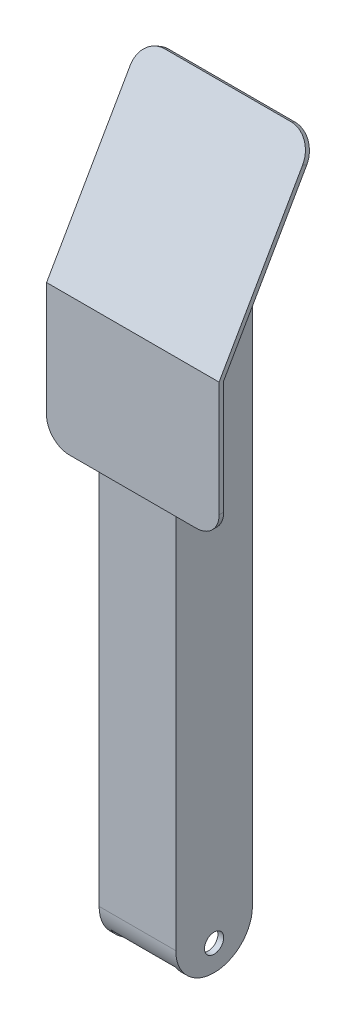
ISO-10303-21;
HEADER;
FILE_DESCRIPTION(('STEP AP214'),'2;1');
FILE_NAME('part.step','',(''),(''),'','','');
FILE_SCHEMA(('AUTOMOTIVE_DESIGN { 1 0 10303 214 1 1 1 1 }'));
ENDSEC;
DATA;
#1=APPLICATION_CONTEXT('core data for automotive mechanical design processes');
#2=APPLICATION_PROTOCOL_DEFINITION('international standard','automotive_design',2000,#1);
#3=PRODUCT_CONTEXT('',#1,'mechanical');
#4=PRODUCT('Part','Part','',(#3));
#5=PRODUCT_RELATED_PRODUCT_CATEGORY('part','',(#4));
#6=PRODUCT_DEFINITION_FORMATION('','',#4);
#7=PRODUCT_DEFINITION_CONTEXT('part definition',#1,'design');
#8=PRODUCT_DEFINITION('design','',#6,#7);
#9=PRODUCT_DEFINITION_SHAPE('','',#8);
#10=(LENGTH_UNIT() NAMED_UNIT(*) SI_UNIT(.MILLI.,.METRE.));
#11=(NAMED_UNIT(*) PLANE_ANGLE_UNIT() SI_UNIT($,.RADIAN.));
#12=(NAMED_UNIT(*) SI_UNIT($,.STERADIAN.) SOLID_ANGLE_UNIT());
#13=UNCERTAINTY_MEASURE_WITH_UNIT(LENGTH_MEASURE(1.E-05),#10,'distance_accuracy_value','');
#14=(GEOMETRIC_REPRESENTATION_CONTEXT(3) GLOBAL_UNCERTAINTY_ASSIGNED_CONTEXT((#13)) GLOBAL_UNIT_ASSIGNED_CONTEXT((#10,
#11,#12)) REPRESENTATION_CONTEXT('',''));
#15=CARTESIAN_POINT('',(0.,0.,0.));
#16=DIRECTION('',(0.,0.,1.));
#17=DIRECTION('',(1.,0.,0.));
#18=AXIS2_PLACEMENT_3D('',#15,#16,#17);
#19=CARTESIAN_POINT('',(-12.7,228.6,12.7));
#20=DIRECTION('',(0.,0.,-1.));
#21=DIRECTION('',(-1.,0.,0.));
#22=AXIS2_PLACEMENT_3D('',#19,#20,#21);
#23=PLANE('',#22);
#24=DIRECTION('',(-1.,0.,0.));
#25=VECTOR('',#24,1.);
#26=CARTESIAN_POINT('',(28.575,138.834720202102,12.7));
#27=LINE('',#26,#25);
#28=CARTESIAN_POINT('',(12.7,138.834720202102,12.7));
#29=VERTEX_POINT('',#28);
#30=CARTESIAN_POINT('',(-12.7,138.834720202102,12.7));
#31=VERTEX_POINT('',#30);
#32=EDGE_CURVE('E422',#29,#31,#27,.T.);
#33=ORIENTED_EDGE('',*,*,#32,.T.);
#34=DIRECTION('',(0.,-1.,0.));
#35=VECTOR('',#34,1.);
#36=CARTESIAN_POINT('',(-12.7,228.6,12.7));
#37=LINE('',#36,#35);
#38=CARTESIAN_POINT('',(-12.7,12.7,12.7));
#39=VERTEX_POINT('',#38);
#40=EDGE_CURVE('E336',#31,#39,#37,.T.);
#41=ORIENTED_EDGE('',*,*,#40,.T.);
#42=DIRECTION('',(1.,0.,0.));
#43=VECTOR('',#42,1.);
#44=CARTESIAN_POINT('',(-12.7,12.7,12.7));
#45=LINE('',#44,#43);
#46=CARTESIAN_POINT('',(12.7,12.7,12.7));
#47=VERTEX_POINT('',#46);
#48=EDGE_CURVE('E253',#39,#47,#45,.T.);
#49=ORIENTED_EDGE('',*,*,#48,.T.);
#50=DIRECTION('',(0.,-1.,0.));
#51=VECTOR('',#50,1.);
#52=CARTESIAN_POINT('',(12.7,228.6,12.7));
#53=LINE('',#52,#51);
#54=EDGE_CURVE('E333',#29,#47,#53,.T.);
#55=ORIENTED_EDGE('',*,*,#54,.F.);
#56=EDGE_LOOP('',(#33,#41,#49,#55));
#57=FACE_BOUND('',#56,.T.);
#58=ADVANCED_FACE('F93',(#57),#23,.F.);
#59=CARTESIAN_POINT('',(12.7,228.6,12.7));
#60=DIRECTION('',(-1.,0.,0.));
#61=DIRECTION('',(0.,0.,1.));
#62=AXIS2_PLACEMENT_3D('',#59,#60,#61);
#63=PLANE('',#62);
#64=CARTESIAN_POINT('',(12.7,8.50899999999999,0.));
#65=DIRECTION('',(1.,0.,0.));
#66=DIRECTION('',(0.,0.,-1.));
#67=AXIS2_PLACEMENT_3D('',#64,#65,#66);
#68=CIRCLE('',#67,3.175);
#69=CARTESIAN_POINT('',(12.7,8.50899999999999,-3.175));
#70=VERTEX_POINT('',#69);
#71=EDGE_CURVE('E269',#70,#70,#68,.T.);
#72=ORIENTED_EDGE('',*,*,#71,.F.);
#73=EDGE_LOOP('',(#72));
#74=FACE_BOUND('',#73,.T.);
#75=CARTESIAN_POINT('',(12.7,184.15,12.7));
#76=VERTEX_POINT('',#75);
#77=EDGE_CURVE('E251',#76,#29,#53,.T.);
#78=ORIENTED_EDGE('',*,*,#77,.T.);
#79=ORIENTED_EDGE('',*,*,#54,.T.);
#80=CARTESIAN_POINT('',(12.7,12.7,0.));
#81=DIRECTION('',(1.,0.,0.));
#82=DIRECTION('',(0.,0.,-1.));
#83=AXIS2_PLACEMENT_3D('',#80,#81,#82);
#84=CIRCLE('',#83,12.7);
#85=CARTESIAN_POINT('',(12.7,12.7,-12.7));
#86=VERTEX_POINT('',#85);
#87=EDGE_CURVE('E278',#47,#86,#84,.T.);
#88=ORIENTED_EDGE('',*,*,#87,.T.);
#89=DIRECTION('',(0.,-1.,0.));
#90=VECTOR('',#89,1.);
#91=CARTESIAN_POINT('',(12.7,228.6,-12.7));
#92=LINE('',#91,#90);
#93=CARTESIAN_POINT('',(12.7,228.6,-12.7));
#94=VERTEX_POINT('',#93);
#95=EDGE_CURVE('E345',#94,#86,#92,.T.);
#96=ORIENTED_EDGE('',*,*,#95,.F.);
#97=DIRECTION('',(0.,0.868243142124459,-0.496138938356834));
#98=VECTOR('',#97,1.);
#99=CARTESIAN_POINT('',(12.7,50.8,88.9));
#100=LINE('',#99,#98);
#101=EDGE_CURVE('E274',#76,#94,#100,.T.);
#102=ORIENTED_EDGE('',*,*,#101,.F.);
#103=EDGE_LOOP('',(#78,#79,#88,#96,#102));
#104=FACE_BOUND('',#103,.T.);
#105=ADVANCED_FACE('F411',(#74,#104),#63,.F.);
#106=CARTESIAN_POINT('',(-12.7,228.6,12.7));
#107=DIRECTION('',(1.,0.,0.));
#108=DIRECTION('',(0.,0.,-1.));
#109=AXIS2_PLACEMENT_3D('',#106,#107,#108);
#110=PLANE('',#109);
#111=CARTESIAN_POINT('',(-12.7,8.50899999999999,0.));
#112=DIRECTION('',(1.,0.,0.));
#113=DIRECTION('',(0.,0.,-1.));
#114=AXIS2_PLACEMENT_3D('',#111,#112,#113);
#115=CIRCLE('',#114,3.175);
#116=CARTESIAN_POINT('',(-12.7,8.50899999999999,-3.175));
#117=VERTEX_POINT('',#116);
#118=EDGE_CURVE('E259',#117,#117,#115,.T.);
#119=ORIENTED_EDGE('',*,*,#118,.T.);
#120=EDGE_LOOP('',(#119));
#121=FACE_BOUND('',#120,.T.);
#122=CARTESIAN_POINT('',(-12.7,12.7,0.));
#123=DIRECTION('',(1.,0.,0.));
#124=DIRECTION('',(0.,0.,-1.));
#125=AXIS2_PLACEMENT_3D('',#122,#123,#124);
#126=CIRCLE('',#125,12.7);
#127=CARTESIAN_POINT('',(-12.7,12.7,-12.7));
#128=VERTEX_POINT('',#127);
#129=EDGE_CURVE('E284',#39,#128,#126,.T.);
#130=ORIENTED_EDGE('',*,*,#129,.F.);
#131=ORIENTED_EDGE('',*,*,#40,.F.);
#132=CARTESIAN_POINT('',(-12.7,184.15,12.7));
#133=VERTEX_POINT('',#132);
#134=EDGE_CURVE('E337',#133,#31,#37,.T.);
#135=ORIENTED_EDGE('',*,*,#134,.F.);
#136=DIRECTION('',(0.,0.868243142124459,-0.496138938356834));
#137=VECTOR('',#136,1.);
#138=CARTESIAN_POINT('',(-12.7,50.8,88.9));
#139=LINE('',#138,#137);
#140=CARTESIAN_POINT('',(-12.7,228.6,-12.7));
#141=VERTEX_POINT('',#140);
#142=EDGE_CURVE('E277',#133,#141,#139,.T.);
#143=ORIENTED_EDGE('',*,*,#142,.T.);
#144=DIRECTION('',(0.,-1.,0.));
#145=VECTOR('',#144,1.);
#146=CARTESIAN_POINT('',(-12.7,228.6,-12.7));
#147=LINE('',#146,#145);
#148=EDGE_CURVE('E341',#141,#128,#147,.T.);
#149=ORIENTED_EDGE('',*,*,#148,.T.);
#150=EDGE_LOOP('',(#130,#131,#135,#143,#149));
#151=FACE_BOUND('',#150,.T.);
#152=ADVANCED_FACE('F424',(#121,#151),#110,.F.);
#153=CARTESIAN_POINT('',(10.795,228.6,10.795));
#154=DIRECTION('',(-1.,0.,0.));
#155=DIRECTION('',(0.,0.,1.));
#156=AXIS2_PLACEMENT_3D('',#153,#154,#155);
#157=PLANE('',#156);
#158=CARTESIAN_POINT('',(10.795,8.50899999999999,0.));
#159=DIRECTION('',(-1.,0.,0.));
#160=DIRECTION('',(0.,0.,1.));
#161=AXIS2_PLACEMENT_3D('',#158,#159,#160);
#162=CIRCLE('',#161,3.175);
#163=CARTESIAN_POINT('',(10.795,8.50899999999999,3.175));
#164=VERTEX_POINT('',#163);
#165=EDGE_CURVE('E309',#164,#164,#162,.T.);
#166=ORIENTED_EDGE('',*,*,#165,.F.);
#167=EDGE_LOOP('',(#166));
#168=FACE_BOUND('',#167,.T.);
#169=CARTESIAN_POINT('',(10.795,12.7,0.));
#170=DIRECTION('',(-1.,0.,0.));
#171=DIRECTION('',(0.,0.,1.));
#172=AXIS2_PLACEMENT_3D('',#169,#170,#171);
#173=CIRCLE('',#172,12.7);
#174=CARTESIAN_POINT('',(10.795,6.00985986693851,-10.795));
#175=VERTEX_POINT('',#174);
#176=CARTESIAN_POINT('',(10.795,6.0098598669385,10.795));
#177=VERTEX_POINT('',#176);
#178=EDGE_CURVE('E305',#175,#177,#173,.T.);
#179=ORIENTED_EDGE('',*,*,#178,.T.);
#180=DIRECTION('',(0.,-1.,0.));
#181=VECTOR('',#180,1.);
#182=CARTESIAN_POINT('',(10.795,228.6,10.795));
#183=LINE('',#182,#181);
#184=CARTESIAN_POINT('',(10.795,187.48375,10.795));
#185=VERTEX_POINT('',#184);
#186=EDGE_CURVE('E313',#185,#177,#183,.T.);
#187=ORIENTED_EDGE('',*,*,#186,.F.);
#188=DIRECTION('',(0.,-0.868243142124459,0.496138938356834));
#189=VECTOR('',#188,1.);
#190=CARTESIAN_POINT('',(10.795,218.479076923077,-6.91661538461539));
#191=LINE('',#190,#189);
#192=CARTESIAN_POINT('',(10.795,225.26625,-10.795));
#193=VERTEX_POINT('',#192);
#194=EDGE_CURVE('E297',#193,#185,#191,.T.);
#195=ORIENTED_EDGE('',*,*,#194,.F.);
#196=DIRECTION('',(0.,-1.,0.));
#197=VECTOR('',#196,1.);
#198=CARTESIAN_POINT('',(10.795,228.6,-10.795));
#199=LINE('',#198,#197);
#200=EDGE_CURVE('E325',#193,#175,#199,.T.);
#201=ORIENTED_EDGE('',*,*,#200,.T.);
#202=EDGE_LOOP('',(#179,#187,#195,#201));
#203=FACE_BOUND('',#202,.T.);
#204=ADVANCED_FACE('F521',(#168,#203),#157,.T.);
#205=CARTESIAN_POINT('',(-10.795,228.6,10.795));
#206=DIRECTION('',(1.,0.,0.));
#207=DIRECTION('',(0.,0.,-1.));
#208=AXIS2_PLACEMENT_3D('',#205,#206,#207);
#209=PLANE('',#208);
#210=CARTESIAN_POINT('',(-10.795,8.50899999999999,0.));
#211=DIRECTION('',(1.,0.,0.));
#212=DIRECTION('',(0.,0.,-1.));
#213=AXIS2_PLACEMENT_3D('',#210,#211,#212);
#214=CIRCLE('',#213,3.175);
#215=CARTESIAN_POINT('',(-10.795,8.50899999999999,-3.175));
#216=VERTEX_POINT('',#215);
#217=EDGE_CURVE('E308',#216,#216,#214,.T.);
#218=ORIENTED_EDGE('',*,*,#217,.F.);
#219=EDGE_LOOP('',(#218));
#220=FACE_BOUND('',#219,.T.);
#221=DIRECTION('',(0.,-1.,0.));
#222=VECTOR('',#221,1.);
#223=CARTESIAN_POINT('',(-10.795,228.6,10.795));
#224=LINE('',#223,#222);
#225=CARTESIAN_POINT('',(-10.795,187.48375,10.795));
#226=VERTEX_POINT('',#225);
#227=CARTESIAN_POINT('',(-10.795,6.0098598669385,10.795));
#228=VERTEX_POINT('',#227);
#229=EDGE_CURVE('E317',#226,#228,#224,.T.);
#230=ORIENTED_EDGE('',*,*,#229,.T.);
#231=CARTESIAN_POINT('',(-10.795,12.7,0.));
#232=DIRECTION('',(1.,0.,0.));
#233=DIRECTION('',(0.,0.,-1.));
#234=AXIS2_PLACEMENT_3D('',#231,#232,#233);
#235=CIRCLE('',#234,12.7);
#236=CARTESIAN_POINT('',(-10.795,6.00985986693851,-10.795));
#237=VERTEX_POINT('',#236);
#238=EDGE_CURVE('E353',#228,#237,#235,.T.);
#239=ORIENTED_EDGE('',*,*,#238,.T.);
#240=DIRECTION('',(0.,-1.,0.));
#241=VECTOR('',#240,1.);
#242=CARTESIAN_POINT('',(-10.795,228.6,-10.795));
#243=LINE('',#242,#241);
#244=CARTESIAN_POINT('',(-10.795,225.26625,-10.795));
#245=VERTEX_POINT('',#244);
#246=EDGE_CURVE('E321',#245,#237,#243,.T.);
#247=ORIENTED_EDGE('',*,*,#246,.F.);
#248=DIRECTION('',(0.,0.868243142124459,-0.496138938356834));
#249=VECTOR('',#248,1.);
#250=CARTESIAN_POINT('',(-10.795,218.479076923077,-6.91661538461539));
#251=LINE('',#250,#249);
#252=EDGE_CURVE('E281',#226,#245,#251,.T.);
#253=ORIENTED_EDGE('',*,*,#252,.F.);
#254=EDGE_LOOP('',(#230,#239,#247,#253));
#255=FACE_BOUND('',#254,.T.);
#256=ADVANCED_FACE('F534',(#220,#255),#209,.T.);
#257=CARTESIAN_POINT('',(-10.795,228.6,10.795));
#258=DIRECTION('',(0.,0.,-1.));
#259=DIRECTION('',(-1.,0.,0.));
#260=AXIS2_PLACEMENT_3D('',#257,#258,#259);
#261=PLANE('',#260);
#262=ORIENTED_EDGE('',*,*,#186,.T.);
#263=DIRECTION('',(1.,0.,0.));
#264=VECTOR('',#263,1.);
#265=CARTESIAN_POINT('',(-12.7,6.0098598669385,10.795));
#266=LINE('',#265,#264);
#267=EDGE_CURVE('E357',#177,#228,#266,.F.);
#268=ORIENTED_EDGE('',*,*,#267,.T.);
#269=ORIENTED_EDGE('',*,*,#229,.F.);
#270=DIRECTION('',(-1.,0.,0.));
#271=VECTOR('',#270,1.);
#272=CARTESIAN_POINT('',(-10.795,187.48375,10.795));
#273=LINE('',#272,#271);
#274=EDGE_CURVE('E349',#185,#226,#273,.T.);
#275=ORIENTED_EDGE('',*,*,#274,.F.);
#276=EDGE_LOOP('',(#262,#268,#269,#275));
#277=FACE_BOUND('',#276,.T.);
#278=ADVANCED_FACE('F528',(#277),#261,.T.);
#279=CARTESIAN_POINT('',(-12.7,228.6,-12.7));
#280=DIRECTION('',(0.,0.,1.));
#281=DIRECTION('',(1.,0.,0.));
#282=AXIS2_PLACEMENT_3D('',#279,#280,#281);
#283=PLANE('',#282);
#284=DIRECTION('',(1.,0.,0.));
#285=VECTOR('',#284,1.);
#286=CARTESIAN_POINT('',(-12.7,12.7,-12.7));
#287=LINE('',#286,#285);
#288=EDGE_CURVE('E273',#128,#86,#287,.T.);
#289=ORIENTED_EDGE('',*,*,#288,.F.);
#290=ORIENTED_EDGE('',*,*,#148,.F.);
#291=DIRECTION('',(-1.,0.,0.));
#292=VECTOR('',#291,1.);
#293=CARTESIAN_POINT('',(-12.7,228.6,-12.7));
#294=LINE('',#293,#292);
#295=EDGE_CURVE('E329',#94,#141,#294,.T.);
#296=ORIENTED_EDGE('',*,*,#295,.F.);
#297=ORIENTED_EDGE('',*,*,#95,.T.);
#298=EDGE_LOOP('',(#289,#290,#296,#297));
#299=FACE_BOUND('',#298,.T.);
#300=ADVANCED_FACE('F427',(#299),#283,.F.);
#301=CARTESIAN_POINT('',(-10.795,228.6,-10.795));
#302=DIRECTION('',(0.,0.,1.));
#303=DIRECTION('',(1.,0.,0.));
#304=AXIS2_PLACEMENT_3D('',#301,#302,#303);
#305=PLANE('',#304);
#306=ORIENTED_EDGE('',*,*,#246,.T.);
#307=DIRECTION('',(1.,0.,0.));
#308=VECTOR('',#307,1.);
#309=CARTESIAN_POINT('',(-12.7,6.00985986693851,-10.795));
#310=LINE('',#309,#308);
#311=EDGE_CURVE('E301',#237,#175,#310,.T.);
#312=ORIENTED_EDGE('',*,*,#311,.T.);
#313=ORIENTED_EDGE('',*,*,#200,.F.);
#314=DIRECTION('',(1.,0.,0.));
#315=VECTOR('',#314,1.);
#316=CARTESIAN_POINT('',(-10.795,225.26625,-10.795));
#317=LINE('',#316,#315);
#318=EDGE_CURVE('E293',#245,#193,#317,.T.);
#319=ORIENTED_EDGE('',*,*,#318,.F.);
#320=EDGE_LOOP('',(#306,#312,#313,#319));
#321=FACE_BOUND('',#320,.T.);
#322=ADVANCED_FACE('F527',(#321),#305,.T.);
#323=CARTESIAN_POINT('',(-12.7,12.7,0.));
#324=DIRECTION('',(1.,0.,0.));
#325=DIRECTION('',(0.,0.,-1.));
#326=AXIS2_PLACEMENT_3D('',#323,#324,#325);
#327=CYLINDRICAL_SURFACE('',#326,12.7);
#328=ORIENTED_EDGE('',*,*,#87,.F.);
#329=ORIENTED_EDGE('',*,*,#48,.F.);
#330=ORIENTED_EDGE('',*,*,#129,.T.);
#331=ORIENTED_EDGE('',*,*,#288,.T.);
#332=EDGE_LOOP('',(#328,#329,#330,#331));
#333=FACE_BOUND('',#332,.T.);
#334=ORIENTED_EDGE('',*,*,#311,.F.);
#335=ORIENTED_EDGE('',*,*,#238,.F.);
#336=ORIENTED_EDGE('',*,*,#267,.F.);
#337=ORIENTED_EDGE('',*,*,#178,.F.);
#338=EDGE_LOOP('',(#334,#335,#336,#337));
#339=FACE_BOUND('',#338,.T.);
#340=ADVANCED_FACE('F417',(#333,#339),#327,.T.);
#341=CARTESIAN_POINT('',(-12.7,8.50899999999999,0.));
#342=DIRECTION('',(1.,0.,0.));
#343=DIRECTION('',(0.,0.,-1.));
#344=AXIS2_PLACEMENT_3D('',#341,#342,#343);
#345=CYLINDRICAL_SURFACE('',#344,3.175);
#346=ORIENTED_EDGE('',*,*,#217,.T.);
#347=EDGE_LOOP('',(#346));
#348=FACE_BOUND('',#347,.T.);
#349=ORIENTED_EDGE('',*,*,#118,.F.);
#350=EDGE_LOOP('',(#349));
#351=FACE_BOUND('',#350,.T.);
#352=ADVANCED_FACE('F545',(#348,#351),#345,.F.);
#353=ORIENTED_EDGE('',*,*,#165,.T.);
#354=EDGE_LOOP('',(#353));
#355=FACE_BOUND('',#354,.T.);
#356=ORIENTED_EDGE('',*,*,#71,.T.);
#357=EDGE_LOOP('',(#356));
#358=FACE_BOUND('',#357,.T.);
#359=ADVANCED_FACE('F548',(#355,#358),#345,.F.);
#360=CARTESIAN_POINT('',(-28.575,0.,0.));
#361=DIRECTION('',(-1.,0.,0.));
#362=DIRECTION('',(0.,0.,1.));
#363=AXIS2_PLACEMENT_3D('',#360,#361,#362);
#364=PLANE('',#363);
#365=DIRECTION('',(0.,1.,0.));
#366=VECTOR('',#365,1.);
#367=CARTESIAN_POINT('',(-28.575,184.15,12.7));
#368=LINE('',#367,#366);
#369=CARTESIAN_POINT('',(-28.575,146.454720202102,12.7));
#370=VERTEX_POINT('',#369);
#371=CARTESIAN_POINT('',(-28.575,184.15,12.7));
#372=VERTEX_POINT('',#371);
#373=EDGE_CURVE('E436',#370,#372,#368,.T.);
#374=ORIENTED_EDGE('',*,*,#373,.F.);
#375=DIRECTION('',(0.,0.,-1.));
#376=VECTOR('',#375,1.);
#377=CARTESIAN_POINT('',(-28.575,146.454720202102,14.224));
#378=LINE('',#377,#376);
#379=CARTESIAN_POINT('',(-28.575,146.454720202102,14.224));
#380=VERTEX_POINT('',#379);
#381=EDGE_CURVE('E391',#370,#380,#378,.F.);
#382=ORIENTED_EDGE('',*,*,#381,.T.);
#383=DIRECTION('',(0.,-1.,0.));
#384=VECTOR('',#383,1.);
#385=CARTESIAN_POINT('',(-28.575,138.834720202102,14.224));
#386=LINE('',#385,#384);
#387=CARTESIAN_POINT('',(-28.575,184.554720202102,14.224));
#388=VERTEX_POINT('',#387);
#389=EDGE_CURVE('E238',#388,#380,#386,.T.);
#390=ORIENTED_EDGE('',*,*,#389,.F.);
#391=DIRECTION('',(0.,-0.868243142124459,0.496138938356834));
#392=VECTOR('',#391,1.);
#393=CARTESIAN_POINT('',(-28.575,239.688159727005,-17.280822585659));
#394=LINE('',#393,#392);
#395=CARTESIAN_POINT('',(-28.575,233.072146984016,-13.5002438753799));
#396=VERTEX_POINT('',#395);
#397=EDGE_CURVE('E443',#396,#388,#394,.T.);
#398=ORIENTED_EDGE('',*,*,#397,.F.);
#399=DIRECTION('',(0.,0.496138938356805,0.868243142124476));
#400=VECTOR('',#399,1.);
#401=CARTESIAN_POINT('',(-28.575,232.316031241961,-14.8234464239778));
#402=LINE('',#401,#400);
#403=CARTESIAN_POINT('',(-28.575,232.316031241961,-14.8234464239775));
#404=VERTEX_POINT('',#403);
#405=EDGE_CURVE('E388',#396,#404,#402,.F.);
#406=ORIENTED_EDGE('',*,*,#405,.T.);
#407=DIRECTION('',(0.,0.868243142124459,-0.496138938356834));
#408=VECTOR('',#407,1.);
#409=CARTESIAN_POINT('',(-28.575,184.15,12.7));
#410=LINE('',#409,#408);
#411=EDGE_CURVE('E440',#372,#404,#410,.T.);
#412=ORIENTED_EDGE('',*,*,#411,.F.);
#413=EDGE_LOOP('',(#374,#382,#390,#398,#406,#412));
#414=FACE_BOUND('',#413,.T.);
#415=ADVANCED_FACE('F479',(#414),#364,.T.);
#416=CARTESIAN_POINT('',(28.575,0.,0.));
#417=DIRECTION('',(-1.,0.,0.));
#418=DIRECTION('',(0.,0.,1.));
#419=AXIS2_PLACEMENT_3D('',#416,#417,#418);
#420=PLANE('',#419);
#421=DIRECTION('',(0.,-1.,0.));
#422=VECTOR('',#421,1.);
#423=CARTESIAN_POINT('',(28.575,138.834720202102,14.224));
#424=LINE('',#423,#422);
#425=CARTESIAN_POINT('',(28.575,184.554720202102,14.224));
#426=VERTEX_POINT('',#425);
#427=CARTESIAN_POINT('',(28.575,146.454720202102,14.224));
#428=VERTEX_POINT('',#427);
#429=EDGE_CURVE('E446',#426,#428,#424,.T.);
#430=ORIENTED_EDGE('',*,*,#429,.T.);
#431=DIRECTION('',(0.,0.,-1.));
#432=VECTOR('',#431,1.);
#433=CARTESIAN_POINT('',(28.575,146.454720202102,0.));
#434=LINE('',#433,#432);
#435=CARTESIAN_POINT('',(28.575,146.454720202102,12.7));
#436=VERTEX_POINT('',#435);
#437=EDGE_CURVE('E234',#428,#436,#434,.T.);
#438=ORIENTED_EDGE('',*,*,#437,.T.);
#439=DIRECTION('',(0.,1.,0.));
#440=VECTOR('',#439,1.);
#441=CARTESIAN_POINT('',(28.575,184.15,12.7));
#442=LINE('',#441,#440);
#443=CARTESIAN_POINT('',(28.575,184.15,12.7));
#444=VERTEX_POINT('',#443);
#445=EDGE_CURVE('E226',#436,#444,#442,.T.);
#446=ORIENTED_EDGE('',*,*,#445,.T.);
#447=DIRECTION('',(0.,0.868243142124459,-0.496138938356834));
#448=VECTOR('',#447,1.);
#449=CARTESIAN_POINT('',(28.575,184.15,12.7));
#450=LINE('',#449,#448);
#451=CARTESIAN_POINT('',(28.575,232.316031241961,-14.8234464239775));
#452=VERTEX_POINT('',#451);
#453=EDGE_CURVE('E231',#444,#452,#450,.T.);
#454=ORIENTED_EDGE('',*,*,#453,.T.);
#455=DIRECTION('',(0.,0.496138938356805,0.868243142124476));
#456=VECTOR('',#455,1.);
#457=CARTESIAN_POINT('',(28.575,181.516031241967,-103.723446423973));
#458=LINE('',#457,#456);
#459=CARTESIAN_POINT('',(28.575,233.072146984016,-13.5002438753799));
#460=VERTEX_POINT('',#459);
#461=EDGE_CURVE('E364',#452,#460,#458,.T.);
#462=ORIENTED_EDGE('',*,*,#461,.T.);
#463=DIRECTION('',(0.,-0.868243142124459,0.496138938356834));
#464=VECTOR('',#463,1.);
#465=CARTESIAN_POINT('',(28.575,239.688159727005,-17.280822585659));
#466=LINE('',#465,#464);
#467=EDGE_CURVE('E246',#460,#426,#466,.T.);
#468=ORIENTED_EDGE('',*,*,#467,.T.);
#469=EDGE_LOOP('',(#430,#438,#446,#454,#462,#468));
#470=FACE_BOUND('',#469,.T.);
#471=ADVANCED_FACE('F229',(#470),#420,.F.);
#472=CARTESIAN_POINT('',(28.575,138.834720202102,12.7));
#473=DIRECTION('',(0.,1.,0.));
#474=DIRECTION('',(0.,0.,1.));
#475=AXIS2_PLACEMENT_3D('',#472,#473,#474);
#476=PLANE('',#475);
#477=CARTESIAN_POINT('',(20.955,138.834720202102,12.7));
#478=VERTEX_POINT('',#477);
#479=EDGE_CURVE('E454',#478,#29,#27,.T.);
#480=ORIENTED_EDGE('',*,*,#479,.F.);
#481=DIRECTION('',(0.,0.,-1.));
#482=VECTOR('',#481,1.);
#483=CARTESIAN_POINT('',(20.955,138.834720202102,12.7));
#484=LINE('',#483,#482);
#485=CARTESIAN_POINT('',(20.955,138.834720202102,14.224));
#486=VERTEX_POINT('',#485);
#487=EDGE_CURVE('E376',#478,#486,#484,.F.);
#488=ORIENTED_EDGE('',*,*,#487,.T.);
#489=DIRECTION('',(-1.,0.,0.));
#490=VECTOR('',#489,1.);
#491=CARTESIAN_POINT('',(28.575,138.834720202102,14.224));
#492=LINE('',#491,#490);
#493=CARTESIAN_POINT('',(-20.955,138.834720202102,14.224));
#494=VERTEX_POINT('',#493);
#495=EDGE_CURVE('E457',#486,#494,#492,.T.);
#496=ORIENTED_EDGE('',*,*,#495,.T.);
#497=DIRECTION('',(0.,0.,-1.));
#498=VECTOR('',#497,1.);
#499=CARTESIAN_POINT('',(-20.955,138.834720202102,12.7));
#500=LINE('',#499,#498);
#501=CARTESIAN_POINT('',(-20.955,138.834720202102,12.7));
#502=VERTEX_POINT('',#501);
#503=EDGE_CURVE('E372',#494,#502,#500,.T.);
#504=ORIENTED_EDGE('',*,*,#503,.T.);
#505=EDGE_CURVE('E458',#31,#502,#27,.T.);
#506=ORIENTED_EDGE('',*,*,#505,.F.);
#507=ORIENTED_EDGE('',*,*,#32,.F.);
#508=EDGE_LOOP('',(#480,#488,#496,#504,#506,#507));
#509=FACE_BOUND('',#508,.T.);
#510=ADVANCED_FACE('F490',(#509),#476,.F.);
#511=CARTESIAN_POINT('',(28.575,138.834720202102,14.224));
#512=DIRECTION('',(0.,0.,-1.));
#513=DIRECTION('',(0.,1.,0.));
#514=AXIS2_PLACEMENT_3D('',#511,#512,#513);
#515=PLANE('',#514);
#516=ORIENTED_EDGE('',*,*,#495,.F.);
#517=CARTESIAN_POINT('',(20.955,146.454720202102,14.224));
#518=DIRECTION('',(0.,0.,-1.));
#519=DIRECTION('',(0.,1.,0.));
#520=AXIS2_PLACEMENT_3D('',#517,#518,#519);
#521=CIRCLE('',#520,7.62);
#522=EDGE_CURVE('E382',#486,#428,#521,.F.);
#523=ORIENTED_EDGE('',*,*,#522,.T.);
#524=ORIENTED_EDGE('',*,*,#429,.F.);
#525=DIRECTION('',(-1.,0.,0.));
#526=VECTOR('',#525,1.);
#527=CARTESIAN_POINT('',(28.575,184.554720202102,14.224));
#528=LINE('',#527,#526);
#529=EDGE_CURVE('E462',#426,#388,#528,.T.);
#530=ORIENTED_EDGE('',*,*,#529,.T.);
#531=ORIENTED_EDGE('',*,*,#389,.T.);
#532=CARTESIAN_POINT('',(-20.955,146.454720202102,14.224));
#533=DIRECTION('',(0.,0.,-1.));
#534=DIRECTION('',(0.,1.,0.));
#535=AXIS2_PLACEMENT_3D('',#532,#533,#534);
#536=CIRCLE('',#535,7.62);
#537=EDGE_CURVE('E379',#380,#494,#536,.F.);
#538=ORIENTED_EDGE('',*,*,#537,.T.);
#539=EDGE_LOOP('',(#516,#523,#524,#530,#531,#538));
#540=FACE_BOUND('',#539,.T.);
#541=ADVANCED_FACE('F483',(#540),#515,.F.);
#542=CARTESIAN_POINT('',(28.575,239.688159727005,-17.280822585659));
#543=DIRECTION('',(0.,-0.496138938356834,-0.868243142124459));
#544=DIRECTION('',(0.,0.868243142124459,-0.496138938356834));
#545=AXIS2_PLACEMENT_3D('',#542,#543,#544);
#546=PLANE('',#545);
#547=DIRECTION('',(-1.,0.,0.));
#548=VECTOR('',#547,1.);
#549=CARTESIAN_POINT('',(28.575,239.688159727005,-17.280822585659));
#550=LINE('',#549,#548);
#551=CARTESIAN_POINT('',(20.955,239.688159727005,-17.280822585659));
#552=VERTEX_POINT('',#551);
#553=CARTESIAN_POINT('',(-20.955,239.688159727005,-17.280822585659));
#554=VERTEX_POINT('',#553);
#555=EDGE_CURVE('E465',#552,#554,#550,.T.);
#556=ORIENTED_EDGE('',*,*,#555,.T.);
#557=CARTESIAN_POINT('',(-20.955,233.072146984016,-13.5002438753799));
#558=DIRECTION('',(0.,-0.496138938356834,-0.868243142124459));
#559=DIRECTION('',(0.,0.868243142124459,-0.496138938356834));
#560=AXIS2_PLACEMENT_3D('',#557,#558,#559);
#561=CIRCLE('',#560,7.62);
#562=EDGE_CURVE('E403',#554,#396,#561,.F.);
#563=ORIENTED_EDGE('',*,*,#562,.T.);
#564=ORIENTED_EDGE('',*,*,#397,.T.);
#565=ORIENTED_EDGE('',*,*,#529,.F.);
#566=ORIENTED_EDGE('',*,*,#467,.F.);
#567=CARTESIAN_POINT('',(20.955,233.072146984016,-13.5002438753799));
#568=DIRECTION('',(0.,-0.496138938356834,-0.868243142124459));
#569=DIRECTION('',(0.,0.868243142124459,-0.496138938356834));
#570=AXIS2_PLACEMENT_3D('',#567,#568,#569);
#571=CIRCLE('',#570,7.62);
#572=EDGE_CURVE('E400',#460,#552,#571,.F.);
#573=ORIENTED_EDGE('',*,*,#572,.T.);
#574=EDGE_LOOP('',(#556,#563,#564,#565,#566,#573));
#575=FACE_BOUND('',#574,.T.);
#576=ADVANCED_FACE('F476',(#575),#546,.F.);
#577=CARTESIAN_POINT('',(28.575,238.932043984949,-18.6040251342566));
#578=DIRECTION('',(0.,-0.868243142124476,0.496138938356805));
#579=DIRECTION('',(0.,-0.496138938356805,-0.868243142124476));
#580=AXIS2_PLACEMENT_3D('',#577,#578,#579);
#581=PLANE('',#580);
#582=DIRECTION('',(-1.,0.,0.));
#583=VECTOR('',#582,1.);
#584=CARTESIAN_POINT('',(28.575,238.932043984949,-18.6040251342566));
#585=LINE('',#584,#583);
#586=CARTESIAN_POINT('',(20.955,238.932043984949,-18.6040251342566));
#587=VERTEX_POINT('',#586);
#588=CARTESIAN_POINT('',(-20.955,238.932043984949,-18.6040251342566));
#589=VERTEX_POINT('',#588);
#590=EDGE_CURVE('E262',#587,#589,#585,.T.);
#591=ORIENTED_EDGE('',*,*,#590,.T.);
#592=DIRECTION('',(0.,0.496138938356805,0.868243142124476));
#593=VECTOR('',#592,1.);
#594=CARTESIAN_POINT('',(-20.955,239.688159727005,-17.280822585659));
#595=LINE('',#594,#593);
#596=EDGE_CURVE('E396',#589,#554,#595,.T.);
#597=ORIENTED_EDGE('',*,*,#596,.T.);
#598=ORIENTED_EDGE('',*,*,#555,.F.);
#599=DIRECTION('',(0.,0.496138938356805,0.868243142124476));
#600=VECTOR('',#599,1.);
#601=CARTESIAN_POINT('',(20.955,238.932043984949,-18.6040251342566));
#602=LINE('',#601,#600);
#603=EDGE_CURVE('E114',#552,#587,#602,.F.);
#604=ORIENTED_EDGE('',*,*,#603,.T.);
#605=EDGE_LOOP('',(#591,#597,#598,#604));
#606=FACE_BOUND('',#605,.T.);
#607=ADVANCED_FACE('F471',(#606),#581,.F.);
#608=CARTESIAN_POINT('',(28.575,184.15,12.7));
#609=DIRECTION('',(0.,0.,1.));
#610=DIRECTION('',(1.,0.,0.));
#611=AXIS2_PLACEMENT_3D('',#608,#609,#610);
#612=PLANE('',#611);
#613=ORIENTED_EDGE('',*,*,#505,.T.);
#614=CARTESIAN_POINT('',(-20.955,146.454720202102,12.7));
#615=DIRECTION('',(0.,0.,1.));
#616=DIRECTION('',(1.,0.,0.));
#617=AXIS2_PLACEMENT_3D('',#614,#615,#616);
#618=CIRCLE('',#617,7.62);
#619=EDGE_CURVE('E385',#502,#370,#618,.F.);
#620=ORIENTED_EDGE('',*,*,#619,.T.);
#621=ORIENTED_EDGE('',*,*,#373,.T.);
#622=DIRECTION('',(-1.,0.,0.));
#623=VECTOR('',#622,1.);
#624=CARTESIAN_POINT('',(28.575,184.15,12.7));
#625=LINE('',#624,#623);
#626=EDGE_CURVE('E254',#133,#372,#625,.T.);
#627=ORIENTED_EDGE('',*,*,#626,.F.);
#628=ORIENTED_EDGE('',*,*,#134,.T.);
#629=EDGE_LOOP('',(#613,#620,#621,#627,#628));
#630=FACE_BOUND('',#629,.T.);
#631=ADVANCED_FACE('F433',(#630),#612,.F.);
#632=ORIENTED_EDGE('',*,*,#445,.F.);
#633=CARTESIAN_POINT('',(20.955,146.454720202102,12.7));
#634=DIRECTION('',(0.,0.,1.));
#635=DIRECTION('',(1.,0.,0.));
#636=AXIS2_PLACEMENT_3D('',#633,#634,#635);
#637=CIRCLE('',#636,7.62);
#638=EDGE_CURVE('E369',#436,#478,#637,.F.);
#639=ORIENTED_EDGE('',*,*,#638,.T.);
#640=ORIENTED_EDGE('',*,*,#479,.T.);
#641=ORIENTED_EDGE('',*,*,#77,.F.);
#642=EDGE_CURVE('E243',#444,#76,#625,.T.);
#643=ORIENTED_EDGE('',*,*,#642,.F.);
#644=EDGE_LOOP('',(#632,#639,#640,#641,#643));
#645=FACE_BOUND('',#644,.T.);
#646=ADVANCED_FACE('F249',(#645),#612,.F.);
#647=CARTESIAN_POINT('',(28.575,184.15,12.7));
#648=DIRECTION('',(0.,0.496138938356834,0.868243142124459));
#649=DIRECTION('',(0.,-0.868243142124459,0.496138938356834));
#650=AXIS2_PLACEMENT_3D('',#647,#648,#649);
#651=PLANE('',#650);
#652=ORIENTED_EDGE('',*,*,#411,.T.);
#653=CARTESIAN_POINT('',(-20.955,232.316031241961,-14.8234464239775));
#654=DIRECTION('',(0.,0.496138938356834,0.868243142124459));
#655=DIRECTION('',(0.,-0.868243142124459,0.496138938356834));
#656=AXIS2_PLACEMENT_3D('',#653,#654,#655);
#657=CIRCLE('',#656,7.62);
#658=EDGE_CURVE('E12',#404,#589,#657,.F.);
#659=ORIENTED_EDGE('',*,*,#658,.T.);
#660=ORIENTED_EDGE('',*,*,#590,.F.);
#661=CARTESIAN_POINT('',(20.955,232.316031241961,-14.8234464239775));
#662=DIRECTION('',(0.,0.496138938356834,0.868243142124459));
#663=DIRECTION('',(0.,-0.868243142124459,0.496138938356834));
#664=AXIS2_PLACEMENT_3D('',#661,#662,#663);
#665=CIRCLE('',#664,7.62);
#666=EDGE_CURVE('E102',#587,#452,#665,.F.);
#667=ORIENTED_EDGE('',*,*,#666,.T.);
#668=ORIENTED_EDGE('',*,*,#453,.F.);
#669=ORIENTED_EDGE('',*,*,#642,.T.);
#670=ORIENTED_EDGE('',*,*,#101,.T.);
#671=ORIENTED_EDGE('',*,*,#295,.T.);
#672=ORIENTED_EDGE('',*,*,#142,.F.);
#673=ORIENTED_EDGE('',*,*,#626,.T.);
#674=EDGE_LOOP('',(#652,#659,#660,#667,#668,#669,#670,#671,#672,#673));
#675=FACE_BOUND('',#674,.T.);
#676=ADVANCED_FACE('F241',(#675),#651,.F.);
#677=ORIENTED_EDGE('',*,*,#274,.T.);
#678=ORIENTED_EDGE('',*,*,#252,.T.);
#679=ORIENTED_EDGE('',*,*,#318,.T.);
#680=ORIENTED_EDGE('',*,*,#194,.T.);
#681=EDGE_LOOP('',(#677,#678,#679,#680));
#682=FACE_BOUND('',#681,.T.);
#683=ADVANCED_FACE('F501',(#682),#651,.F.);
#684=CARTESIAN_POINT('',(20.955,146.454720202102,0.));
#685=DIRECTION('',(0.,0.,-1.));
#686=DIRECTION('',(-1.,0.,0.));
#687=AXIS2_PLACEMENT_3D('',#684,#685,#686);
#688=CYLINDRICAL_SURFACE('',#687,7.62);
#689=ORIENTED_EDGE('',*,*,#522,.F.);
#690=ORIENTED_EDGE('',*,*,#487,.F.);
#691=ORIENTED_EDGE('',*,*,#638,.F.);
#692=ORIENTED_EDGE('',*,*,#437,.F.);
#693=EDGE_LOOP('',(#689,#690,#691,#692));
#694=FACE_BOUND('',#693,.T.);
#695=ADVANCED_FACE('F499',(#694),#688,.T.);
#696=CARTESIAN_POINT('',(-20.955,146.454720202102,12.7));
#697=DIRECTION('',(0.,0.,1.));
#698=DIRECTION('',(1.,0.,0.));
#699=AXIS2_PLACEMENT_3D('',#696,#697,#698);
#700=CYLINDRICAL_SURFACE('',#699,7.62);
#701=ORIENTED_EDGE('',*,*,#537,.F.);
#702=ORIENTED_EDGE('',*,*,#381,.F.);
#703=ORIENTED_EDGE('',*,*,#619,.F.);
#704=ORIENTED_EDGE('',*,*,#503,.F.);
#705=EDGE_LOOP('',(#701,#702,#703,#704));
#706=FACE_BOUND('',#705,.T.);
#707=ADVANCED_FACE('F487',(#706),#700,.T.);
#708=CARTESIAN_POINT('',(-20.955,232.316031241961,-14.8234464239778));
#709=DIRECTION('',(0.,-0.496138938356805,-0.868243142124476));
#710=DIRECTION('',(0.,0.868243142124476,-0.496138938356805));
#711=AXIS2_PLACEMENT_3D('',#708,#709,#710);
#712=CYLINDRICAL_SURFACE('',#711,7.62);
#713=ORIENTED_EDGE('',*,*,#658,.F.);
#714=ORIENTED_EDGE('',*,*,#405,.F.);
#715=ORIENTED_EDGE('',*,*,#562,.F.);
#716=ORIENTED_EDGE('',*,*,#596,.F.);
#717=EDGE_LOOP('',(#713,#714,#715,#716));
#718=FACE_BOUND('',#717,.T.);
#719=ADVANCED_FACE('F473',(#718),#712,.T.);
#720=CARTESIAN_POINT('',(20.955,181.516031241967,-103.723446423973));
#721=DIRECTION('',(0.,0.496138938356805,0.868243142124476));
#722=DIRECTION('',(0.,-0.868243142124476,0.496138938356805));
#723=AXIS2_PLACEMENT_3D('',#720,#721,#722);
#724=CYLINDRICAL_SURFACE('',#723,7.62);
#725=ORIENTED_EDGE('',*,*,#666,.F.);
#726=ORIENTED_EDGE('',*,*,#603,.F.);
#727=ORIENTED_EDGE('',*,*,#572,.F.);
#728=ORIENTED_EDGE('',*,*,#461,.F.);
#729=EDGE_LOOP('',(#725,#726,#727,#728));
#730=FACE_BOUND('',#729,.T.);
#731=ADVANCED_FACE('F95',(#730),#724,.T.);
#732=CLOSED_SHELL('',(#58,#105,#152,#204,#256,#278,#300,#322,#340,#352,#359,#415,#471,#510,#541,
#576,#607,#631,#646,#676,#683,#695,#707,#719,#731));
#733=MANIFOLD_SOLID_BREP('B2',#732);
#734=ADVANCED_BREP_SHAPE_REPRESENTATION('',(#18,#733),#14);
#735=SHAPE_DEFINITION_REPRESENTATION(#9,#734);
ENDSEC;
END-ISO-10303-21;
